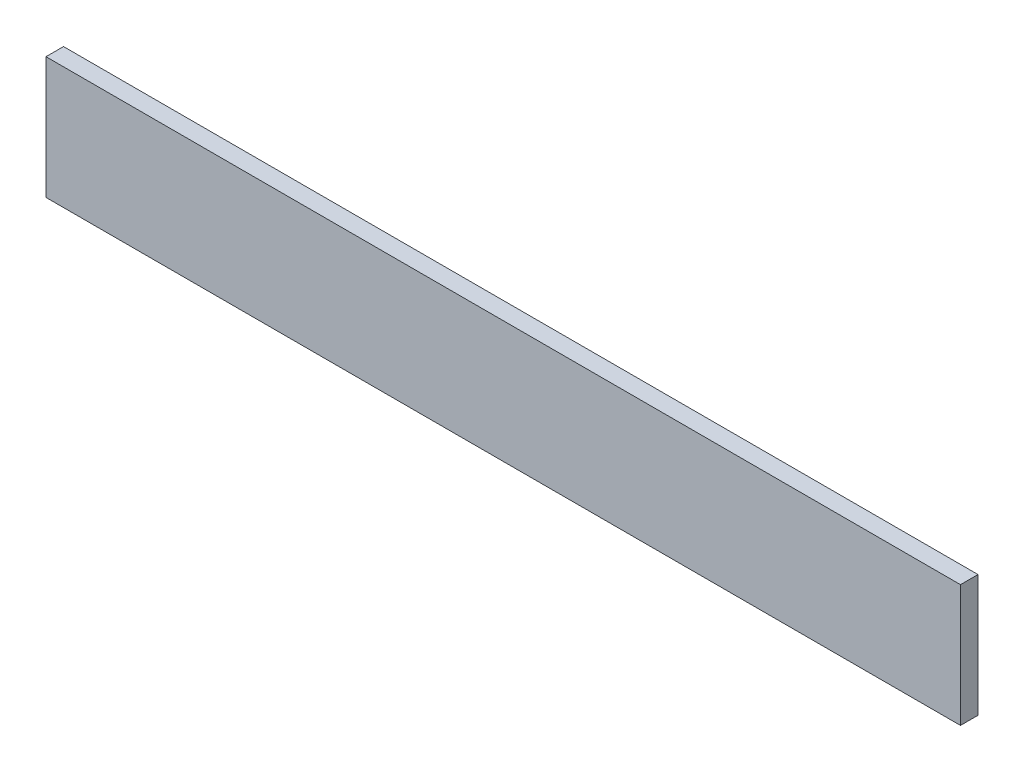
ISO-10303-21;
HEADER;
FILE_DESCRIPTION(('STEP AP214'),'2;1');
FILE_NAME('part.step','',(''),(''),'','','');
FILE_SCHEMA(('AUTOMOTIVE_DESIGN { 1 0 10303 214 1 1 1 1 }'));
ENDSEC;
DATA;
#1=APPLICATION_CONTEXT('core data for automotive mechanical design processes');
#2=APPLICATION_PROTOCOL_DEFINITION('international standard','automotive_design',2000,#1);
#3=PRODUCT_CONTEXT('',#1,'mechanical');
#4=PRODUCT('Part','Part','',(#3));
#5=PRODUCT_RELATED_PRODUCT_CATEGORY('part','',(#4));
#6=PRODUCT_DEFINITION_FORMATION('','',#4);
#7=PRODUCT_DEFINITION_CONTEXT('part definition',#1,'design');
#8=PRODUCT_DEFINITION('design','',#6,#7);
#9=PRODUCT_DEFINITION_SHAPE('','',#8);
#10=(LENGTH_UNIT() NAMED_UNIT(*) SI_UNIT(.MILLI.,.METRE.));
#11=(NAMED_UNIT(*) PLANE_ANGLE_UNIT() SI_UNIT($,.RADIAN.));
#12=(NAMED_UNIT(*) SI_UNIT($,.STERADIAN.) SOLID_ANGLE_UNIT());
#13=UNCERTAINTY_MEASURE_WITH_UNIT(LENGTH_MEASURE(1.E-05),#10,'distance_accuracy_value','');
#14=(GEOMETRIC_REPRESENTATION_CONTEXT(3) GLOBAL_UNCERTAINTY_ASSIGNED_CONTEXT((#13)) GLOBAL_UNIT_ASSIGNED_CONTEXT((#10,
#11,#12)) REPRESENTATION_CONTEXT('',''));
#15=CARTESIAN_POINT('',(0.,0.,0.));
#16=DIRECTION('',(0.,0.,1.));
#17=DIRECTION('',(1.,0.,0.));
#18=AXIS2_PLACEMENT_3D('',#15,#16,#17);
#19=CARTESIAN_POINT('',(476.25,63.5,18.25625));
#20=DIRECTION('',(-1.,0.,0.));
#21=DIRECTION('',(0.,0.,1.));
#22=AXIS2_PLACEMENT_3D('',#19,#20,#21);
#23=PLANE('',#22);
#24=DIRECTION('',(0.,1.,0.));
#25=VECTOR('',#24,1.);
#26=CARTESIAN_POINT('',(476.25,63.5,0.));
#27=LINE('',#26,#25);
#28=CARTESIAN_POINT('',(476.25,-63.5,0.));
#29=VERTEX_POINT('',#28);
#30=CARTESIAN_POINT('',(476.25,63.5,0.));
#31=VERTEX_POINT('',#30);
#32=EDGE_CURVE('E96',#29,#31,#27,.T.);
#33=ORIENTED_EDGE('',*,*,#32,.T.);
#34=DIRECTION('',(0.,0.,-1.));
#35=VECTOR('',#34,1.);
#36=CARTESIAN_POINT('',(476.25,63.5,18.25625));
#37=LINE('',#36,#35);
#38=CARTESIAN_POINT('',(476.25,63.5,18.25625));
#39=VERTEX_POINT('',#38);
#40=EDGE_CURVE('E11',#39,#31,#37,.T.);
#41=ORIENTED_EDGE('',*,*,#40,.F.);
#42=DIRECTION('',(0.,1.,0.));
#43=VECTOR('',#42,1.);
#44=CARTESIAN_POINT('',(476.25,63.5,18.25625));
#45=LINE('',#44,#43);
#46=CARTESIAN_POINT('',(476.25,-63.5,18.25625));
#47=VERTEX_POINT('',#46);
#48=EDGE_CURVE('E84',#47,#39,#45,.T.);
#49=ORIENTED_EDGE('',*,*,#48,.F.);
#50=DIRECTION('',(0.,0.,-1.));
#51=VECTOR('',#50,1.);
#52=CARTESIAN_POINT('',(476.25,-63.5,18.25625));
#53=LINE('',#52,#51);
#54=EDGE_CURVE('E92',#47,#29,#53,.T.);
#55=ORIENTED_EDGE('',*,*,#54,.T.);
#56=EDGE_LOOP('',(#33,#41,#49,#55));
#57=FACE_BOUND('',#56,.T.);
#58=ADVANCED_FACE('F33',(#57),#23,.F.);
#59=CARTESIAN_POINT('',(-476.25,63.5,18.25625));
#60=DIRECTION('',(0.,-1.,0.));
#61=DIRECTION('',(0.,0.,-1.));
#62=AXIS2_PLACEMENT_3D('',#59,#60,#61);
#63=PLANE('',#62);
#64=DIRECTION('',(-1.,0.,0.));
#65=VECTOR('',#64,1.);
#66=CARTESIAN_POINT('',(-476.25,63.5,0.));
#67=LINE('',#66,#65);
#68=CARTESIAN_POINT('',(-476.25,63.5,0.));
#69=VERTEX_POINT('',#68);
#70=EDGE_CURVE('E88',#31,#69,#67,.T.);
#71=ORIENTED_EDGE('',*,*,#70,.T.);
#72=DIRECTION('',(0.,0.,-1.));
#73=VECTOR('',#72,1.);
#74=CARTESIAN_POINT('',(-476.25,63.5,18.25625));
#75=LINE('',#74,#73);
#76=CARTESIAN_POINT('',(-476.25,63.5,18.25625));
#77=VERTEX_POINT('',#76);
#78=EDGE_CURVE('E41',#77,#69,#75,.T.);
#79=ORIENTED_EDGE('',*,*,#78,.F.);
#80=DIRECTION('',(-1.,0.,0.));
#81=VECTOR('',#80,1.);
#82=CARTESIAN_POINT('',(-476.25,63.5,18.25625));
#83=LINE('',#82,#81);
#84=EDGE_CURVE('E79',#39,#77,#83,.T.);
#85=ORIENTED_EDGE('',*,*,#84,.F.);
#86=ORIENTED_EDGE('',*,*,#40,.T.);
#87=EDGE_LOOP('',(#71,#79,#85,#86));
#88=FACE_BOUND('',#87,.T.);
#89=ADVANCED_FACE('F87',(#88),#63,.F.);
#90=CARTESIAN_POINT('',(-476.25,63.5,18.25625));
#91=DIRECTION('',(1.,0.,0.));
#92=DIRECTION('',(0.,0.,-1.));
#93=AXIS2_PLACEMENT_3D('',#90,#91,#92);
#94=PLANE('',#93);
#95=DIRECTION('',(0.,-1.,0.));
#96=VECTOR('',#95,1.);
#97=CARTESIAN_POINT('',(-476.25,63.5,0.));
#98=LINE('',#97,#96);
#99=CARTESIAN_POINT('',(-476.25,-63.5,0.));
#100=VERTEX_POINT('',#99);
#101=EDGE_CURVE('E66',#69,#100,#98,.T.);
#102=ORIENTED_EDGE('',*,*,#101,.T.);
#103=DIRECTION('',(0.,0.,-1.));
#104=VECTOR('',#103,1.);
#105=CARTESIAN_POINT('',(-476.25,-63.5,18.25625));
#106=LINE('',#105,#104);
#107=CARTESIAN_POINT('',(-476.25,-63.5,18.25625));
#108=VERTEX_POINT('',#107);
#109=EDGE_CURVE('E89',#108,#100,#106,.T.);
#110=ORIENTED_EDGE('',*,*,#109,.F.);
#111=DIRECTION('',(0.,-1.,0.));
#112=VECTOR('',#111,1.);
#113=CARTESIAN_POINT('',(-476.25,63.5,18.25625));
#114=LINE('',#113,#112);
#115=EDGE_CURVE('E82',#77,#108,#114,.T.);
#116=ORIENTED_EDGE('',*,*,#115,.F.);
#117=ORIENTED_EDGE('',*,*,#78,.T.);
#118=EDGE_LOOP('',(#102,#110,#116,#117));
#119=FACE_BOUND('',#118,.T.);
#120=ADVANCED_FACE('F90',(#119),#94,.F.);
#121=CARTESIAN_POINT('',(-476.25,-63.5,18.25625));
#122=DIRECTION('',(0.,1.,0.));
#123=DIRECTION('',(0.,0.,1.));
#124=AXIS2_PLACEMENT_3D('',#121,#122,#123);
#125=PLANE('',#124);
#126=DIRECTION('',(1.,0.,0.));
#127=VECTOR('',#126,1.);
#128=CARTESIAN_POINT('',(-476.25,-63.5,0.));
#129=LINE('',#128,#127);
#130=EDGE_CURVE('E72',#100,#29,#129,.T.);
#131=ORIENTED_EDGE('',*,*,#130,.T.);
#132=ORIENTED_EDGE('',*,*,#54,.F.);
#133=DIRECTION('',(1.,0.,0.));
#134=VECTOR('',#133,1.);
#135=CARTESIAN_POINT('',(-476.25,-63.5,18.25625));
#136=LINE('',#135,#134);
#137=EDGE_CURVE('E49',#108,#47,#136,.T.);
#138=ORIENTED_EDGE('',*,*,#137,.F.);
#139=ORIENTED_EDGE('',*,*,#109,.T.);
#140=EDGE_LOOP('',(#131,#132,#138,#139));
#141=FACE_BOUND('',#140,.T.);
#142=ADVANCED_FACE('F103',(#141),#125,.F.);
#143=CARTESIAN_POINT('',(0.,0.,18.25625));
#144=DIRECTION('',(0.,0.,1.));
#145=DIRECTION('',(1.,0.,0.));
#146=AXIS2_PLACEMENT_3D('',#143,#144,#145);
#147=PLANE('',#146);
#148=ORIENTED_EDGE('',*,*,#48,.T.);
#149=ORIENTED_EDGE('',*,*,#84,.T.);
#150=ORIENTED_EDGE('',*,*,#115,.T.);
#151=ORIENTED_EDGE('',*,*,#137,.T.);
#152=EDGE_LOOP('',(#148,#149,#150,#151));
#153=FACE_BOUND('',#152,.T.);
#154=ADVANCED_FACE('F80',(#153),#147,.T.);
#155=CARTESIAN_POINT('',(0.,0.,0.));
#156=DIRECTION('',(0.,0.,1.));
#157=DIRECTION('',(1.,0.,0.));
#158=AXIS2_PLACEMENT_3D('',#155,#156,#157);
#159=PLANE('',#158);
#160=ORIENTED_EDGE('',*,*,#32,.F.);
#161=ORIENTED_EDGE('',*,*,#130,.F.);
#162=ORIENTED_EDGE('',*,*,#101,.F.);
#163=ORIENTED_EDGE('',*,*,#70,.F.);
#164=EDGE_LOOP('',(#160,#161,#162,#163));
#165=FACE_BOUND('',#164,.T.);
#166=ADVANCED_FACE('F106',(#165),#159,.F.);
#167=CLOSED_SHELL('',(#58,#89,#120,#142,#154,#166));
#168=MANIFOLD_SOLID_BREP('B2',#167);
#169=ADVANCED_BREP_SHAPE_REPRESENTATION('',(#18,#168),#14);
#170=SHAPE_DEFINITION_REPRESENTATION(#9,#169);
ENDSEC;
END-ISO-10303-21;
